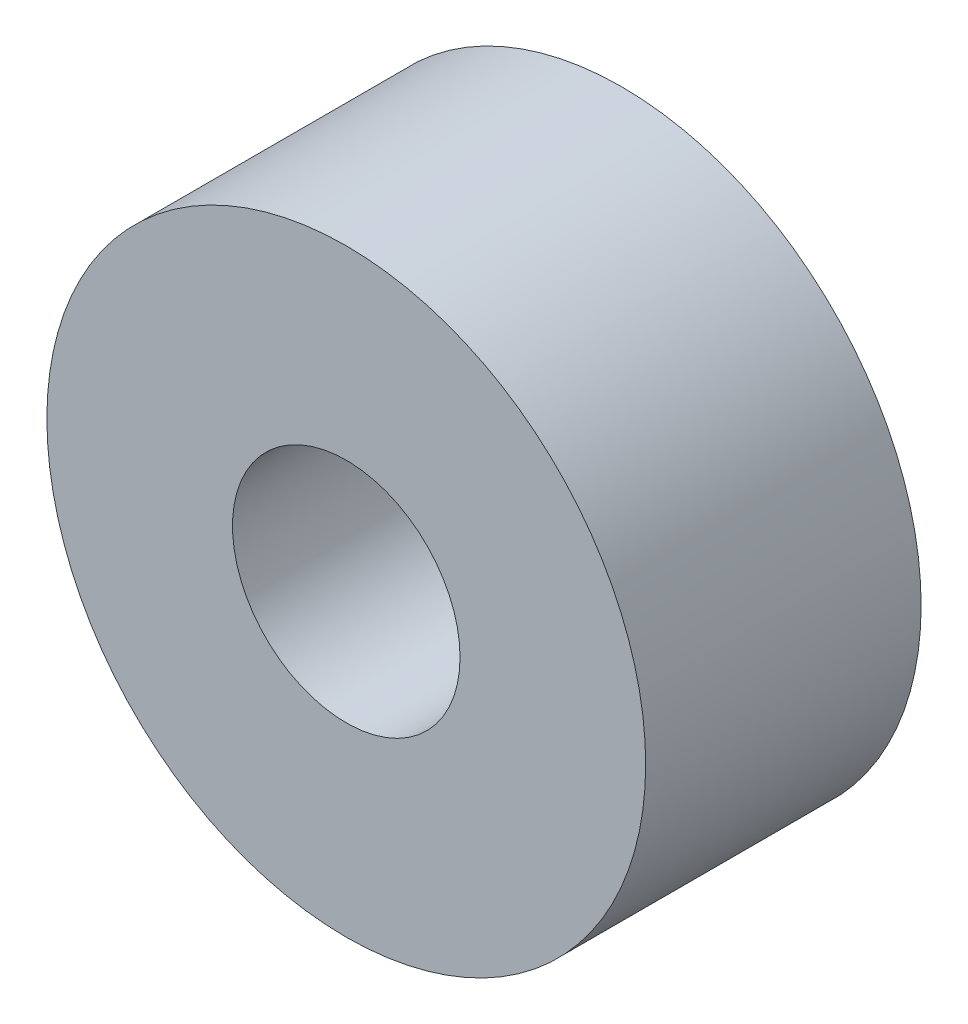
ISO-10303-21;
HEADER;
FILE_DESCRIPTION(('STEP AP214'),'2;1');
FILE_NAME('part.step','',(''),(''),'','','');
FILE_SCHEMA(('AUTOMOTIVE_DESIGN { 1 0 10303 214 1 1 1 1 }'));
ENDSEC;
DATA;
#1=APPLICATION_CONTEXT('core data for automotive mechanical design processes');
#2=APPLICATION_PROTOCOL_DEFINITION('international standard','automotive_design',2000,#1);
#3=PRODUCT_CONTEXT('',#1,'mechanical');
#4=PRODUCT('Part','Part','',(#3));
#5=PRODUCT_RELATED_PRODUCT_CATEGORY('part','',(#4));
#6=PRODUCT_DEFINITION_FORMATION('','',#4);
#7=PRODUCT_DEFINITION_CONTEXT('part definition',#1,'design');
#8=PRODUCT_DEFINITION('design','',#6,#7);
#9=PRODUCT_DEFINITION_SHAPE('','',#8);
#10=(LENGTH_UNIT() NAMED_UNIT(*) SI_UNIT(.MILLI.,.METRE.));
#11=(NAMED_UNIT(*) PLANE_ANGLE_UNIT() SI_UNIT($,.RADIAN.));
#12=(NAMED_UNIT(*) SI_UNIT($,.STERADIAN.) SOLID_ANGLE_UNIT());
#13=UNCERTAINTY_MEASURE_WITH_UNIT(LENGTH_MEASURE(1.E-05),#10,'distance_accuracy_value','');
#14=(GEOMETRIC_REPRESENTATION_CONTEXT(3) GLOBAL_UNCERTAINTY_ASSIGNED_CONTEXT((#13)) GLOBAL_UNIT_ASSIGNED_CONTEXT((#10,
#11,#12)) REPRESENTATION_CONTEXT('',''));
#15=CARTESIAN_POINT('',(0.,0.,0.));
#16=DIRECTION('',(0.,0.,1.));
#17=DIRECTION('',(1.,0.,0.));
#18=AXIS2_PLACEMENT_3D('',#15,#16,#17);
#19=CARTESIAN_POINT('',(0.,0.,5.842));
#20=DIRECTION('',(0.,0.,1.));
#21=DIRECTION('',(1.,0.,0.));
#22=AXIS2_PLACEMENT_3D('',#19,#20,#21);
#23=PLANE('',#22);
#24=CARTESIAN_POINT('',(0.,0.,5.842));
#25=DIRECTION('',(0.,0.,1.));
#26=DIRECTION('',(1.,0.,0.));
#27=AXIS2_PLACEMENT_3D('',#24,#25,#26);
#28=CIRCLE('',#27,6.35);
#29=CARTESIAN_POINT('',(6.35,0.,5.842));
#30=VERTEX_POINT('',#29);
#31=EDGE_CURVE('E10',#30,#30,#28,.T.);
#32=ORIENTED_EDGE('',*,*,#31,.T.);
#33=EDGE_LOOP('',(#32));
#34=FACE_BOUND('',#33,.T.);
#35=CARTESIAN_POINT('',(0.,0.,5.842));
#36=DIRECTION('',(0.,0.,1.));
#37=DIRECTION('',(1.,0.,0.));
#38=AXIS2_PLACEMENT_3D('',#35,#36,#37);
#39=CIRCLE('',#38,2.413);
#40=CARTESIAN_POINT('',(2.413,0.,5.842));
#41=VERTEX_POINT('',#40);
#42=EDGE_CURVE('E44',#41,#41,#39,.T.);
#43=ORIENTED_EDGE('',*,*,#42,.F.);
#44=EDGE_LOOP('',(#43));
#45=FACE_BOUND('',#44,.T.);
#46=ADVANCED_FACE('F33',(#34,#45),#23,.T.);
#47=CARTESIAN_POINT('',(0.,0.,0.));
#48=DIRECTION('',(0.,0.,1.));
#49=DIRECTION('',(1.,0.,0.));
#50=AXIS2_PLACEMENT_3D('',#47,#48,#49);
#51=PLANE('',#50);
#52=CARTESIAN_POINT('',(0.,0.,0.));
#53=DIRECTION('',(0.,0.,1.));
#54=DIRECTION('',(1.,0.,0.));
#55=AXIS2_PLACEMENT_3D('',#52,#53,#54);
#56=CIRCLE('',#55,6.35);
#57=CARTESIAN_POINT('',(6.35,0.,0.));
#58=VERTEX_POINT('',#57);
#59=EDGE_CURVE('E37',#58,#58,#56,.T.);
#60=ORIENTED_EDGE('',*,*,#59,.F.);
#61=EDGE_LOOP('',(#60));
#62=FACE_BOUND('',#61,.T.);
#63=CARTESIAN_POINT('',(0.,0.,0.));
#64=DIRECTION('',(0.,0.,1.));
#65=DIRECTION('',(1.,0.,0.));
#66=AXIS2_PLACEMENT_3D('',#63,#64,#65);
#67=CIRCLE('',#66,2.413);
#68=CARTESIAN_POINT('',(2.413,0.,0.));
#69=VERTEX_POINT('',#68);
#70=EDGE_CURVE('E46',#69,#69,#67,.T.);
#71=ORIENTED_EDGE('',*,*,#70,.T.);
#72=EDGE_LOOP('',(#71));
#73=FACE_BOUND('',#72,.T.);
#74=ADVANCED_FACE('F56',(#62,#73),#51,.F.);
#75=CARTESIAN_POINT('',(0.,0.,5.842));
#76=DIRECTION('',(0.,0.,-1.));
#77=DIRECTION('',(-1.,0.,0.));
#78=AXIS2_PLACEMENT_3D('',#75,#76,#77);
#79=CYLINDRICAL_SURFACE('',#78,6.35);
#80=ORIENTED_EDGE('',*,*,#31,.F.);
#81=EDGE_LOOP('',(#80));
#82=FACE_BOUND('',#81,.T.);
#83=ORIENTED_EDGE('',*,*,#59,.T.);
#84=EDGE_LOOP('',(#83));
#85=FACE_BOUND('',#84,.T.);
#86=ADVANCED_FACE('F35',(#82,#85),#79,.T.);
#87=CARTESIAN_POINT('',(0.,0.,5.842));
#88=DIRECTION('',(0.,0.,-1.));
#89=DIRECTION('',(-1.,0.,0.));
#90=AXIS2_PLACEMENT_3D('',#87,#88,#89);
#91=CYLINDRICAL_SURFACE('',#90,2.413);
#92=ORIENTED_EDGE('',*,*,#42,.T.);
#93=EDGE_LOOP('',(#92));
#94=FACE_BOUND('',#93,.T.);
#95=ORIENTED_EDGE('',*,*,#70,.F.);
#96=EDGE_LOOP('',(#95));
#97=FACE_BOUND('',#96,.T.);
#98=ADVANCED_FACE('F52',(#94,#97),#91,.F.);
#99=CLOSED_SHELL('',(#46,#74,#86,#98));
#100=MANIFOLD_SOLID_BREP('B2',#99);
#101=ADVANCED_BREP_SHAPE_REPRESENTATION('',(#18,#100),#14);
#102=SHAPE_DEFINITION_REPRESENTATION(#9,#101);
ENDSEC;
END-ISO-10303-21;
